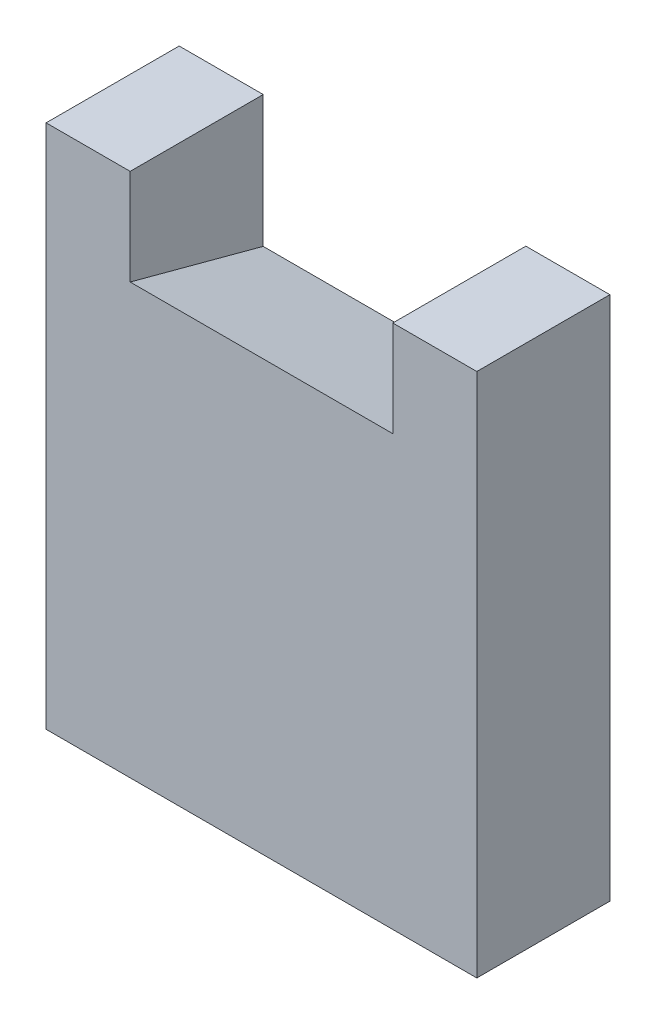
ISO-10303-21;
HEADER;
FILE_DESCRIPTION(('STEP AP214'),'2;1');
FILE_NAME('part.step','',(''),(''),'','','');
FILE_SCHEMA(('AUTOMOTIVE_DESIGN { 1 0 10303 214 1 1 1 1 }'));
ENDSEC;
DATA;
#1=APPLICATION_CONTEXT('core data for automotive mechanical design processes');
#2=APPLICATION_PROTOCOL_DEFINITION('international standard','automotive_design',2000,#1);
#3=PRODUCT_CONTEXT('',#1,'mechanical');
#4=PRODUCT('Part','Part','',(#3));
#5=PRODUCT_RELATED_PRODUCT_CATEGORY('part','',(#4));
#6=PRODUCT_DEFINITION_FORMATION('','',#4);
#7=PRODUCT_DEFINITION_CONTEXT('part definition',#1,'design');
#8=PRODUCT_DEFINITION('design','',#6,#7);
#9=PRODUCT_DEFINITION_SHAPE('','',#8);
#10=(LENGTH_UNIT() NAMED_UNIT(*) SI_UNIT(.MILLI.,.METRE.));
#11=(NAMED_UNIT(*) PLANE_ANGLE_UNIT() SI_UNIT($,.RADIAN.));
#12=(NAMED_UNIT(*) SI_UNIT($,.STERADIAN.) SOLID_ANGLE_UNIT());
#13=UNCERTAINTY_MEASURE_WITH_UNIT(LENGTH_MEASURE(1.E-05),#10,'distance_accuracy_value','');
#14=(GEOMETRIC_REPRESENTATION_CONTEXT(3) GLOBAL_UNCERTAINTY_ASSIGNED_CONTEXT((#13)) GLOBAL_UNIT_ASSIGNED_CONTEXT((#10,
#11,#12)) REPRESENTATION_CONTEXT('',''));
#15=CARTESIAN_POINT('',(0.,0.,0.));
#16=DIRECTION('',(0.,0.,1.));
#17=DIRECTION('',(1.,0.,0.));
#18=AXIS2_PLACEMENT_3D('',#15,#16,#17);
#19=CARTESIAN_POINT('',(0.,0.,7.6));
#20=DIRECTION('',(0.,1.,0.));
#21=DIRECTION('',(-1.,0.,0.));
#22=AXIS2_PLACEMENT_3D('',#19,#20,#21);
#23=PLANE('',#22);
#24=DIRECTION('',(1.,0.,0.));
#25=VECTOR('',#24,1.);
#26=CARTESIAN_POINT('',(0.,0.,0.));
#27=LINE('',#26,#25);
#28=CARTESIAN_POINT('',(19.8,0.,0.));
#29=VERTEX_POINT('',#28);
#30=CARTESIAN_POINT('',(24.6,0.,0.));
#31=VERTEX_POINT('',#30);
#32=EDGE_CURVE('E117',#29,#31,#27,.T.);
#33=ORIENTED_EDGE('',*,*,#32,.F.);
#34=DIRECTION('',(0.,0.,-1.));
#35=VECTOR('',#34,1.);
#36=CARTESIAN_POINT('',(19.8,0.,7.6));
#37=LINE('',#36,#35);
#38=CARTESIAN_POINT('',(19.8,0.,7.6));
#39=VERTEX_POINT('',#38);
#40=EDGE_CURVE('E11',#39,#29,#37,.T.);
#41=ORIENTED_EDGE('',*,*,#40,.F.);
#42=DIRECTION('',(1.,0.,0.));
#43=VECTOR('',#42,1.);
#44=CARTESIAN_POINT('',(0.,0.,7.6));
#45=LINE('',#44,#43);
#46=CARTESIAN_POINT('',(24.6,0.,7.6));
#47=VERTEX_POINT('',#46);
#48=EDGE_CURVE('E127',#39,#47,#45,.T.);
#49=ORIENTED_EDGE('',*,*,#48,.T.);
#50=DIRECTION('',(0.,0.,-1.));
#51=VECTOR('',#50,1.);
#52=CARTESIAN_POINT('',(24.6,0.,7.6));
#53=LINE('',#52,#51);
#54=EDGE_CURVE('E58',#47,#31,#53,.T.);
#55=ORIENTED_EDGE('',*,*,#54,.T.);
#56=EDGE_LOOP('',(#33,#41,#49,#55));
#57=FACE_BOUND('',#56,.T.);
#58=ADVANCED_FACE('F39',(#57),#23,.T.);
#59=CARTESIAN_POINT('',(19.8,0.,7.6));
#60=DIRECTION('',(1.,0.,0.));
#61=DIRECTION('',(0.,0.,-1.));
#62=AXIS2_PLACEMENT_3D('',#59,#60,#61);
#63=PLANE('',#62);
#64=DIRECTION('',(0.,-1.,0.));
#65=VECTOR('',#64,1.);
#66=CARTESIAN_POINT('',(19.8,0.,0.));
#67=LINE('',#66,#65);
#68=CARTESIAN_POINT('',(19.8,-7.51141386247654,0.));
#69=VERTEX_POINT('',#68);
#70=EDGE_CURVE('E107',#29,#69,#67,.T.);
#71=ORIENTED_EDGE('',*,*,#70,.T.);
#72=DIRECTION('',(0.,-0.258819045102521,-0.965925826289068));
#73=VECTOR('',#72,1.);
#74=CARTESIAN_POINT('',(19.8,-5.475,7.6));
#75=LINE('',#74,#73);
#76=CARTESIAN_POINT('',(19.8,-5.475,7.6));
#77=VERTEX_POINT('',#76);
#78=EDGE_CURVE('E49',#77,#69,#75,.T.);
#79=ORIENTED_EDGE('',*,*,#78,.F.);
#80=DIRECTION('',(0.,-1.,0.));
#81=VECTOR('',#80,1.);
#82=CARTESIAN_POINT('',(19.8,0.,7.6));
#83=LINE('',#82,#81);
#84=EDGE_CURVE('E155',#39,#77,#83,.T.);
#85=ORIENTED_EDGE('',*,*,#84,.F.);
#86=ORIENTED_EDGE('',*,*,#40,.T.);
#87=EDGE_LOOP('',(#71,#79,#85,#86));
#88=FACE_BOUND('',#87,.T.);
#89=ADVANCED_FACE('F164',(#88),#63,.F.);
#90=CARTESIAN_POINT('',(0.,-5.475,7.6));
#91=DIRECTION('',(0.,0.965925826289068,-0.258819045102521));
#92=DIRECTION('',(0.,0.258819045102521,0.965925826289068));
#93=AXIS2_PLACEMENT_3D('',#90,#91,#92);
#94=PLANE('',#93);
#95=DIRECTION('',(1.,0.,0.));
#96=VECTOR('',#95,1.);
#97=CARTESIAN_POINT('',(0.,-7.51141386247654,0.));
#98=LINE('',#97,#96);
#99=CARTESIAN_POINT('',(4.8,-7.51141386247654,0.));
#100=VERTEX_POINT('',#99);
#101=EDGE_CURVE('E104',#100,#69,#98,.T.);
#102=ORIENTED_EDGE('',*,*,#101,.F.);
#103=DIRECTION('',(0.,-0.258819045102521,-0.965925826289068));
#104=VECTOR('',#103,1.);
#105=CARTESIAN_POINT('',(4.8,-5.475,7.6));
#106=LINE('',#105,#104);
#107=CARTESIAN_POINT('',(4.8,-5.475,7.6));
#108=VERTEX_POINT('',#107);
#109=EDGE_CURVE('E43',#108,#100,#106,.T.);
#110=ORIENTED_EDGE('',*,*,#109,.F.);
#111=DIRECTION('',(1.,0.,0.));
#112=VECTOR('',#111,1.);
#113=CARTESIAN_POINT('',(0.,-5.475,7.6));
#114=LINE('',#113,#112);
#115=EDGE_CURVE('E151',#108,#77,#114,.T.);
#116=ORIENTED_EDGE('',*,*,#115,.T.);
#117=ORIENTED_EDGE('',*,*,#78,.T.);
#118=EDGE_LOOP('',(#102,#110,#116,#117));
#119=FACE_BOUND('',#118,.T.);
#120=ADVANCED_FACE('F41',(#119),#94,.T.);
#121=CARTESIAN_POINT('',(4.8,0.,7.6));
#122=DIRECTION('',(1.,0.,0.));
#123=DIRECTION('',(0.,1.,0.));
#124=AXIS2_PLACEMENT_3D('',#121,#122,#123);
#125=PLANE('',#124);
#126=DIRECTION('',(0.,-1.,0.));
#127=VECTOR('',#126,1.);
#128=CARTESIAN_POINT('',(4.8,0.,0.));
#129=LINE('',#128,#127);
#130=CARTESIAN_POINT('',(4.8,0.,0.));
#131=VERTEX_POINT('',#130);
#132=EDGE_CURVE('E96',#131,#100,#129,.T.);
#133=ORIENTED_EDGE('',*,*,#132,.F.);
#134=DIRECTION('',(0.,0.,-1.));
#135=VECTOR('',#134,1.);
#136=CARTESIAN_POINT('',(4.8,0.,7.6));
#137=LINE('',#136,#135);
#138=CARTESIAN_POINT('',(4.8,0.,7.6));
#139=VERTEX_POINT('',#138);
#140=EDGE_CURVE('E102',#139,#131,#137,.T.);
#141=ORIENTED_EDGE('',*,*,#140,.F.);
#142=DIRECTION('',(0.,-1.,0.));
#143=VECTOR('',#142,1.);
#144=CARTESIAN_POINT('',(4.8,0.,7.6));
#145=LINE('',#144,#143);
#146=EDGE_CURVE('E100',#139,#108,#145,.T.);
#147=ORIENTED_EDGE('',*,*,#146,.T.);
#148=ORIENTED_EDGE('',*,*,#109,.T.);
#149=EDGE_LOOP('',(#133,#141,#147,#148));
#150=FACE_BOUND('',#149,.T.);
#151=ADVANCED_FACE('F93',(#150),#125,.T.);
#152=CARTESIAN_POINT('',(0.,0.,0.));
#153=VERTEX_POINT('',#152);
#154=EDGE_CURVE('E113',#153,#131,#27,.T.);
#155=ORIENTED_EDGE('',*,*,#154,.F.);
#156=DIRECTION('',(0.,0.,-1.));
#157=VECTOR('',#156,1.);
#158=CARTESIAN_POINT('',(0.,0.,7.6));
#159=LINE('',#158,#157);
#160=CARTESIAN_POINT('',(0.,0.,7.6));
#161=VERTEX_POINT('',#160);
#162=EDGE_CURVE('E135',#161,#153,#159,.T.);
#163=ORIENTED_EDGE('',*,*,#162,.F.);
#164=EDGE_CURVE('E143',#161,#139,#45,.T.);
#165=ORIENTED_EDGE('',*,*,#164,.T.);
#166=ORIENTED_EDGE('',*,*,#140,.T.);
#167=EDGE_LOOP('',(#155,#163,#165,#166));
#168=FACE_BOUND('',#167,.T.);
#169=ADVANCED_FACE('F139',(#168),#23,.T.);
#170=CARTESIAN_POINT('',(0.,0.,7.6));
#171=DIRECTION('',(1.,0.,0.));
#172=DIRECTION('',(0.,1.,0.));
#173=AXIS2_PLACEMENT_3D('',#170,#171,#172);
#174=PLANE('',#173);
#175=DIRECTION('',(0.,-1.,0.));
#176=VECTOR('',#175,1.);
#177=CARTESIAN_POINT('',(0.,0.,0.));
#178=LINE('',#177,#176);
#179=CARTESIAN_POINT('',(0.,-30.,0.));
#180=VERTEX_POINT('',#179);
#181=EDGE_CURVE('E115',#153,#180,#178,.T.);
#182=ORIENTED_EDGE('',*,*,#181,.T.);
#183=DIRECTION('',(0.,0.,-1.));
#184=VECTOR('',#183,1.);
#185=CARTESIAN_POINT('',(0.,-30.,7.6));
#186=LINE('',#185,#184);
#187=CARTESIAN_POINT('',(0.,-30.,7.6));
#188=VERTEX_POINT('',#187);
#189=EDGE_CURVE('E132',#188,#180,#186,.T.);
#190=ORIENTED_EDGE('',*,*,#189,.F.);
#191=DIRECTION('',(0.,-1.,0.));
#192=VECTOR('',#191,1.);
#193=CARTESIAN_POINT('',(0.,0.,7.6));
#194=LINE('',#193,#192);
#195=EDGE_CURVE('E153',#161,#188,#194,.T.);
#196=ORIENTED_EDGE('',*,*,#195,.F.);
#197=ORIENTED_EDGE('',*,*,#162,.T.);
#198=EDGE_LOOP('',(#182,#190,#196,#197));
#199=FACE_BOUND('',#198,.T.);
#200=ADVANCED_FACE('F178',(#199),#174,.F.);
#201=CARTESIAN_POINT('',(0.,-30.,7.6));
#202=DIRECTION('',(0.,1.,0.));
#203=DIRECTION('',(-1.,0.,0.));
#204=AXIS2_PLACEMENT_3D('',#201,#202,#203);
#205=PLANE('',#204);
#206=DIRECTION('',(1.,0.,0.));
#207=VECTOR('',#206,1.);
#208=CARTESIAN_POINT('',(0.,-30.,0.));
#209=LINE('',#208,#207);
#210=CARTESIAN_POINT('',(24.6,-30.,0.));
#211=VERTEX_POINT('',#210);
#212=EDGE_CURVE('E121',#180,#211,#209,.T.);
#213=ORIENTED_EDGE('',*,*,#212,.T.);
#214=DIRECTION('',(0.,0.,-1.));
#215=VECTOR('',#214,1.);
#216=CARTESIAN_POINT('',(24.6,-30.,7.6));
#217=LINE('',#216,#215);
#218=CARTESIAN_POINT('',(24.6,-30.,7.6));
#219=VERTEX_POINT('',#218);
#220=EDGE_CURVE('E129',#219,#211,#217,.T.);
#221=ORIENTED_EDGE('',*,*,#220,.F.);
#222=DIRECTION('',(1.,0.,0.));
#223=VECTOR('',#222,1.);
#224=CARTESIAN_POINT('',(0.,-30.,7.6));
#225=LINE('',#224,#223);
#226=EDGE_CURVE('E160',#188,#219,#225,.T.);
#227=ORIENTED_EDGE('',*,*,#226,.F.);
#228=ORIENTED_EDGE('',*,*,#189,.T.);
#229=EDGE_LOOP('',(#213,#221,#227,#228));
#230=FACE_BOUND('',#229,.T.);
#231=ADVANCED_FACE('F175',(#230),#205,.F.);
#232=CARTESIAN_POINT('',(24.6,0.,7.6));
#233=DIRECTION('',(1.,0.,0.));
#234=DIRECTION('',(0.,1.,0.));
#235=AXIS2_PLACEMENT_3D('',#232,#233,#234);
#236=PLANE('',#235);
#237=DIRECTION('',(0.,-1.,0.));
#238=VECTOR('',#237,1.);
#239=CARTESIAN_POINT('',(24.6,0.,0.));
#240=LINE('',#239,#238);
#241=EDGE_CURVE('E124',#31,#211,#240,.T.);
#242=ORIENTED_EDGE('',*,*,#241,.F.);
#243=ORIENTED_EDGE('',*,*,#54,.F.);
#244=DIRECTION('',(0.,-1.,0.));
#245=VECTOR('',#244,1.);
#246=CARTESIAN_POINT('',(24.6,0.,7.6));
#247=LINE('',#246,#245);
#248=EDGE_CURVE('E130',#47,#219,#247,.T.);
#249=ORIENTED_EDGE('',*,*,#248,.T.);
#250=ORIENTED_EDGE('',*,*,#220,.T.);
#251=EDGE_LOOP('',(#242,#243,#249,#250));
#252=FACE_BOUND('',#251,.T.);
#253=ADVANCED_FACE('F172',(#252),#236,.T.);
#254=CARTESIAN_POINT('',(0.,0.,7.6));
#255=DIRECTION('',(0.,0.,1.));
#256=DIRECTION('',(1.,0.,0.));
#257=AXIS2_PLACEMENT_3D('',#254,#255,#256);
#258=PLANE('',#257);
#259=ORIENTED_EDGE('',*,*,#48,.F.);
#260=ORIENTED_EDGE('',*,*,#84,.T.);
#261=ORIENTED_EDGE('',*,*,#115,.F.);
#262=ORIENTED_EDGE('',*,*,#146,.F.);
#263=ORIENTED_EDGE('',*,*,#164,.F.);
#264=ORIENTED_EDGE('',*,*,#195,.T.);
#265=ORIENTED_EDGE('',*,*,#226,.T.);
#266=ORIENTED_EDGE('',*,*,#248,.F.);
#267=EDGE_LOOP('',(#259,#260,#261,#262,#263,#264,#265,#266));
#268=FACE_BOUND('',#267,.T.);
#269=ADVANCED_FACE('F148',(#268),#258,.T.);
#270=CARTESIAN_POINT('',(0.,0.,0.));
#271=DIRECTION('',(0.,0.,1.));
#272=DIRECTION('',(1.,0.,0.));
#273=AXIS2_PLACEMENT_3D('',#270,#271,#272);
#274=PLANE('',#273);
#275=ORIENTED_EDGE('',*,*,#32,.T.);
#276=ORIENTED_EDGE('',*,*,#241,.T.);
#277=ORIENTED_EDGE('',*,*,#212,.F.);
#278=ORIENTED_EDGE('',*,*,#181,.F.);
#279=ORIENTED_EDGE('',*,*,#154,.T.);
#280=ORIENTED_EDGE('',*,*,#132,.T.);
#281=ORIENTED_EDGE('',*,*,#101,.T.);
#282=ORIENTED_EDGE('',*,*,#70,.F.);
#283=EDGE_LOOP('',(#275,#276,#277,#278,#279,#280,#281,#282));
#284=FACE_BOUND('',#283,.T.);
#285=ADVANCED_FACE('F110',(#284),#274,.F.);
#286=CLOSED_SHELL('',(#58,#89,#120,#151,#169,#200,#231,#253,#269,#285));
#287=MANIFOLD_SOLID_BREP('B2',#286);
#288=ADVANCED_BREP_SHAPE_REPRESENTATION('',(#18,#287),#14);
#289=SHAPE_DEFINITION_REPRESENTATION(#9,#288);
ENDSEC;
END-ISO-10303-21;
